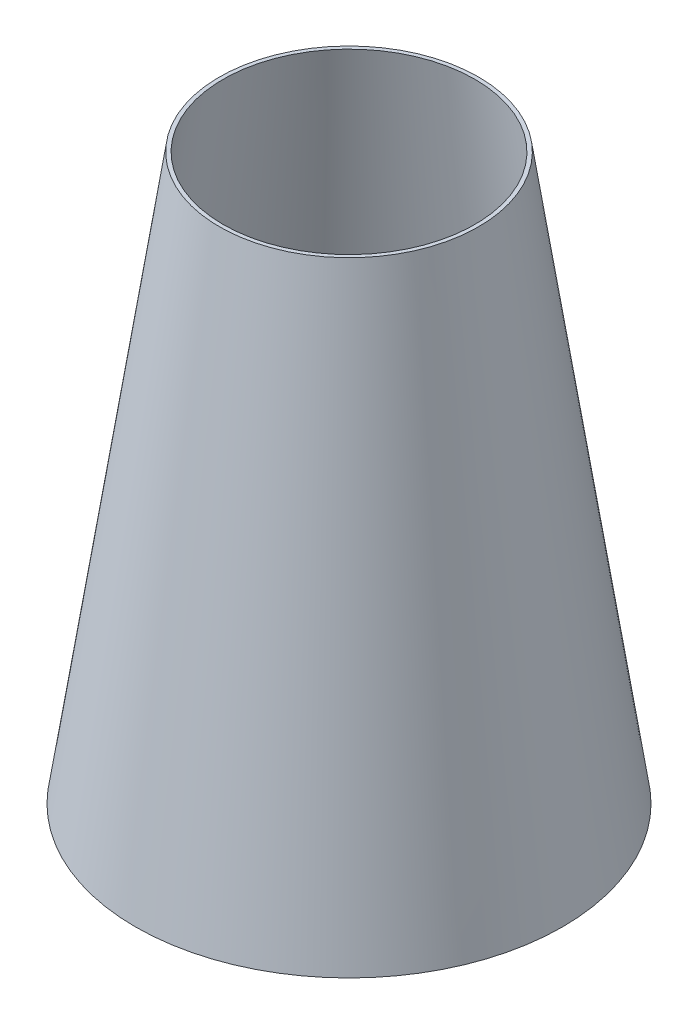
ISO-10303-21;
HEADER;
FILE_DESCRIPTION(('STEP AP214'),'2;1');
FILE_NAME('part.step','',(''),(''),'','','');
FILE_SCHEMA(('AUTOMOTIVE_DESIGN { 1 0 10303 214 1 1 1 1 }'));
ENDSEC;
DATA;
#1=APPLICATION_CONTEXT('core data for automotive mechanical design processes');
#2=APPLICATION_PROTOCOL_DEFINITION('international standard','automotive_design',2000,#1);
#3=PRODUCT_CONTEXT('',#1,'mechanical');
#4=PRODUCT('Part','Part','',(#3));
#5=PRODUCT_RELATED_PRODUCT_CATEGORY('part','',(#4));
#6=PRODUCT_DEFINITION_FORMATION('','',#4);
#7=PRODUCT_DEFINITION_CONTEXT('part definition',#1,'design');
#8=PRODUCT_DEFINITION('design','',#6,#7);
#9=PRODUCT_DEFINITION_SHAPE('','',#8);
#10=(LENGTH_UNIT() NAMED_UNIT(*) SI_UNIT(.MILLI.,.METRE.));
#11=(NAMED_UNIT(*) PLANE_ANGLE_UNIT() SI_UNIT($,.RADIAN.));
#12=(NAMED_UNIT(*) SI_UNIT($,.STERADIAN.) SOLID_ANGLE_UNIT());
#13=UNCERTAINTY_MEASURE_WITH_UNIT(LENGTH_MEASURE(1.E-05),#10,'distance_accuracy_value','');
#14=(GEOMETRIC_REPRESENTATION_CONTEXT(3) GLOBAL_UNCERTAINTY_ASSIGNED_CONTEXT((#13)) GLOBAL_UNIT_ASSIGNED_CONTEXT((#10,
#11,#12)) REPRESENTATION_CONTEXT('',''));
#15=CARTESIAN_POINT('',(0.,0.,0.));
#16=DIRECTION('',(0.,0.,1.));
#17=DIRECTION('',(1.,0.,0.));
#18=AXIS2_PLACEMENT_3D('',#15,#16,#17);
#19=CARTESIAN_POINT('',(-52.3875,160.439449541284,0.));
#20=DIRECTION('',(0.,-1.,0.));
#21=DIRECTION('',(0.,0.,-1.));
#22=AXIS2_PLACEMENT_3D('',#19,#20,#21);
#23=PLANE('',#22);
#24=CARTESIAN_POINT('',(0.,160.439449541284,0.));
#25=DIRECTION('',(0.,-1.,0.));
#26=DIRECTION('',(0.,0.,-1.));
#27=AXIS2_PLACEMENT_3D('',#24,#25,#26);
#28=CIRCLE('',#27,53.975);
#29=CARTESIAN_POINT('',(0.,160.439449541284,-53.975));
#30=VERTEX_POINT('',#29);
#31=EDGE_CURVE('E10',#30,#30,#28,.T.);
#32=ORIENTED_EDGE('',*,*,#31,.F.);
#33=EDGE_LOOP('',(#32));
#34=FACE_BOUND('',#33,.T.);
#35=CARTESIAN_POINT('',(0.,160.439449541284,0.));
#36=DIRECTION('',(0.,-1.,0.));
#37=DIRECTION('',(0.,0.,-1.));
#38=AXIS2_PLACEMENT_3D('',#35,#36,#37);
#39=CIRCLE('',#38,52.3875);
#40=CARTESIAN_POINT('',(0.,160.439449541284,-52.3875));
#41=VERTEX_POINT('',#40);
#42=EDGE_CURVE('E45',#41,#41,#39,.T.);
#43=ORIENTED_EDGE('',*,*,#42,.T.);
#44=EDGE_LOOP('',(#43));
#45=FACE_BOUND('',#44,.T.);
#46=ADVANCED_FACE('F31',(#34,#45),#23,.F.);
#47=CARTESIAN_POINT('',(0.,160.439449541284,0.));
#48=DIRECTION('',(0.,-1.,0.));
#49=DIRECTION('',(0.,0.,-1.));
#50=AXIS2_PLACEMENT_3D('',#47,#48,#49);
#51=CONICAL_SURFACE('',#50,53.975,0.147568071313995);
#52=CARTESIAN_POINT('',(0.,-74.5105504587156,0.));
#53=DIRECTION('',(0.,-1.,0.));
#54=DIRECTION('',(0.,0.,-1.));
#55=AXIS2_PLACEMENT_3D('',#52,#53,#54);
#56=CIRCLE('',#55,88.9);
#57=CARTESIAN_POINT('',(0.,-74.5105504587156,-88.9));
#58=VERTEX_POINT('',#57);
#59=EDGE_CURVE('E37',#58,#58,#56,.T.);
#60=ORIENTED_EDGE('',*,*,#59,.F.);
#61=EDGE_LOOP('',(#60));
#62=FACE_BOUND('',#61,.T.);
#63=ORIENTED_EDGE('',*,*,#31,.T.);
#64=EDGE_LOOP('',(#63));
#65=FACE_BOUND('',#64,.T.);
#66=ADVANCED_FACE('F60',(#62,#65),#51,.T.);
#67=CARTESIAN_POINT('',(-88.9,-74.5105504587156,0.));
#68=DIRECTION('',(0.,1.,0.));
#69=DIRECTION('',(0.,0.,1.));
#70=AXIS2_PLACEMENT_3D('',#67,#68,#69);
#71=PLANE('',#70);
#72=CARTESIAN_POINT('',(0.,-74.5105504587156,0.));
#73=DIRECTION('',(0.,-1.,0.));
#74=DIRECTION('',(0.,0.,-1.));
#75=AXIS2_PLACEMENT_3D('',#72,#73,#74);
#76=CIRCLE('',#75,87.3125);
#77=CARTESIAN_POINT('',(0.,-74.5105504587156,-87.3125));
#78=VERTEX_POINT('',#77);
#79=EDGE_CURVE('E41',#78,#78,#76,.T.);
#80=ORIENTED_EDGE('',*,*,#79,.F.);
#81=EDGE_LOOP('',(#80));
#82=FACE_BOUND('',#81,.T.);
#83=ORIENTED_EDGE('',*,*,#59,.T.);
#84=EDGE_LOOP('',(#83));
#85=FACE_BOUND('',#84,.T.);
#86=ADVANCED_FACE('F55',(#82,#85),#71,.F.);
#87=CARTESIAN_POINT('',(0.,-74.5105504587156,0.));
#88=DIRECTION('',(0.,-1.,0.));
#89=DIRECTION('',(0.,0.,-1.));
#90=AXIS2_PLACEMENT_3D('',#87,#88,#89);
#91=CONICAL_SURFACE('',#90,87.3125,0.147568071313995);
#92=ORIENTED_EDGE('',*,*,#42,.F.);
#93=EDGE_LOOP('',(#92));
#94=FACE_BOUND('',#93,.T.);
#95=ORIENTED_EDGE('',*,*,#79,.T.);
#96=EDGE_LOOP('',(#95));
#97=FACE_BOUND('',#96,.T.);
#98=ADVANCED_FACE('F52',(#94,#97),#91,.F.);
#99=CLOSED_SHELL('',(#46,#66,#86,#98));
#100=MANIFOLD_SOLID_BREP('B2',#99);
#101=ADVANCED_BREP_SHAPE_REPRESENTATION('',(#18,#100),#14);
#102=SHAPE_DEFINITION_REPRESENTATION(#9,#101);
ENDSEC;
END-ISO-10303-21;
